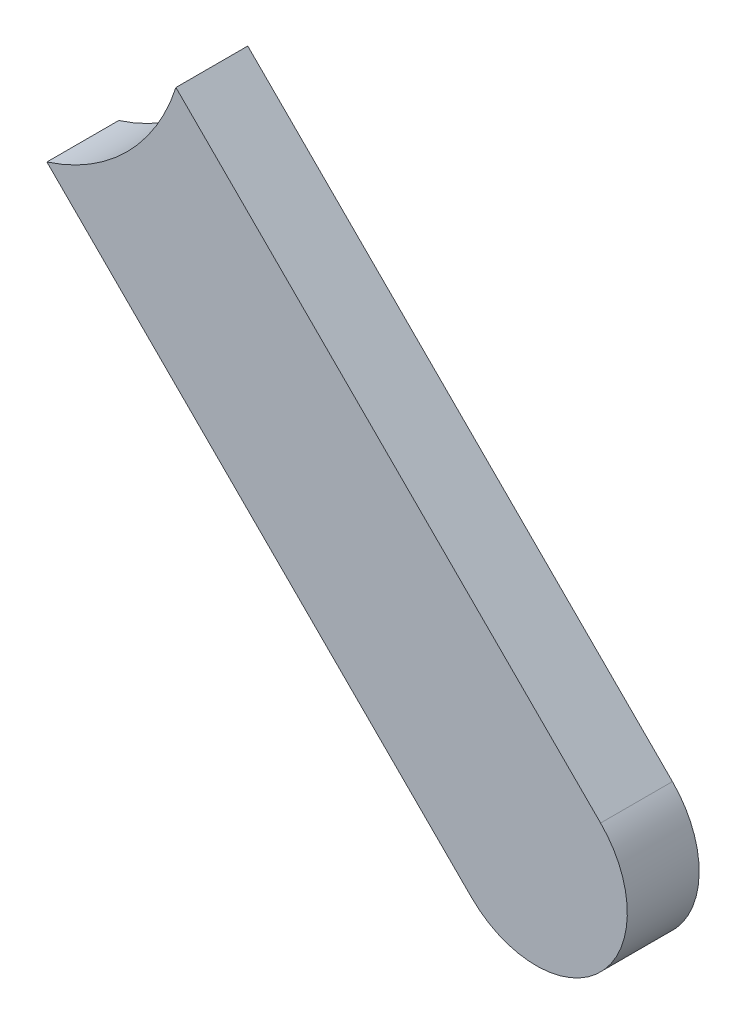
ISO-10303-21;
HEADER;
FILE_DESCRIPTION(('STEP AP214'),'2;1');
FILE_NAME('part.step','',(''),(''),'','','');
FILE_SCHEMA(('AUTOMOTIVE_DESIGN { 1 0 10303 214 1 1 1 1 }'));
ENDSEC;
DATA;
#1=APPLICATION_CONTEXT('core data for automotive mechanical design processes');
#2=APPLICATION_PROTOCOL_DEFINITION('international standard','automotive_design',2000,#1);
#3=PRODUCT_CONTEXT('',#1,'mechanical');
#4=PRODUCT('Part','Part','',(#3));
#5=PRODUCT_RELATED_PRODUCT_CATEGORY('part','',(#4));
#6=PRODUCT_DEFINITION_FORMATION('','',#4);
#7=PRODUCT_DEFINITION_CONTEXT('part definition',#1,'design');
#8=PRODUCT_DEFINITION('design','',#6,#7);
#9=PRODUCT_DEFINITION_SHAPE('','',#8);
#10=(LENGTH_UNIT() NAMED_UNIT(*) SI_UNIT(.MILLI.,.METRE.));
#11=(NAMED_UNIT(*) PLANE_ANGLE_UNIT() SI_UNIT($,.RADIAN.));
#12=(NAMED_UNIT(*) SI_UNIT($,.STERADIAN.) SOLID_ANGLE_UNIT());
#13=UNCERTAINTY_MEASURE_WITH_UNIT(LENGTH_MEASURE(1.E-05),#10,'distance_accuracy_value','');
#14=(GEOMETRIC_REPRESENTATION_CONTEXT(3) GLOBAL_UNCERTAINTY_ASSIGNED_CONTEXT((#13)) GLOBAL_UNIT_ASSIGNED_CONTEXT((#10,
#11,#12)) REPRESENTATION_CONTEXT('',''));
#15=CARTESIAN_POINT('',(0.,0.,0.));
#16=DIRECTION('',(0.,0.,1.));
#17=DIRECTION('',(1.,0.,0.));
#18=AXIS2_PLACEMENT_3D('',#15,#16,#17);
#19=CARTESIAN_POINT('',(129.194064664847,110.850461595153,0.));
#20=DIRECTION('',(0.707106781186548,0.707106781186548,0.));
#21=DIRECTION('',(0.707106781186548,-0.707106781186548,0.));
#22=AXIS2_PLACEMENT_3D('',#19,#20,#21);
#23=PLANE('',#22);
#24=DIRECTION('',(0.707106781186548,-0.707106781186548,0.));
#25=VECTOR('',#24,1.);
#26=CARTESIAN_POINT('',(128.8451322,111.19939406,0.1999996));
#27=LINE('',#26,#25);
#28=CARTESIAN_POINT('',(129.194064664847,110.850461595153,0.1999996));
#29=VERTEX_POINT('',#28);
#30=CARTESIAN_POINT('',(130.37639406,109.6681322,0.1999996));
#31=VERTEX_POINT('',#30);
#32=EDGE_CURVE('E11',#29,#31,#27,.T.);
#33=ORIENTED_EDGE('',*,*,#32,.F.);
#34=DIRECTION('',(0.,0.,1.));
#35=VECTOR('',#34,1.);
#36=CARTESIAN_POINT('',(129.194064664847,110.850461595153,0.));
#37=LINE('',#36,#35);
#38=CARTESIAN_POINT('',(129.194064664847,110.850461595153,0.));
#39=VERTEX_POINT('',#38);
#40=EDGE_CURVE('E24',#39,#29,#37,.T.);
#41=ORIENTED_EDGE('',*,*,#40,.F.);
#42=DIRECTION('',(0.707106781186548,-0.707106781186548,0.));
#43=VECTOR('',#42,1.);
#44=CARTESIAN_POINT('',(128.8451322,111.19939406,0.));
#45=LINE('',#44,#43);
#46=CARTESIAN_POINT('',(130.37639406,109.6681322,0.));
#47=VERTEX_POINT('',#46);
#48=EDGE_CURVE('E75',#39,#47,#45,.T.);
#49=ORIENTED_EDGE('',*,*,#48,.T.);
#50=DIRECTION('',(0.,0.,1.));
#51=VECTOR('',#50,1.);
#52=CARTESIAN_POINT('',(130.37639406,109.6681322,0.));
#53=LINE('',#52,#51);
#54=EDGE_CURVE('E37',#47,#31,#53,.T.);
#55=ORIENTED_EDGE('',*,*,#54,.T.);
#56=EDGE_LOOP('',(#33,#41,#49,#55));
#57=FACE_BOUND('',#56,.T.);
#58=ADVANCED_FACE('F17',(#57),#23,.F.);
#59=CARTESIAN_POINT('',(130.55599873,109.84773687,0.));
#60=DIRECTION('',(0.,0.,-1.));
#61=DIRECTION('',(-0.70710678118652,-0.707106781186576,0.));
#62=AXIS2_PLACEMENT_3D('',#59,#60,#61);
#63=CYLINDRICAL_SURFACE('',#62,0.253999360179556);
#64=CARTESIAN_POINT('',(130.55599873,109.84773687,0.1999996));
#65=DIRECTION('',(0.,0.,1.));
#66=DIRECTION('',(-0.70710678118652,-0.707106781186576,0.));
#67=AXIS2_PLACEMENT_3D('',#64,#65,#66);
#68=CIRCLE('',#67,0.253999360179556);
#69=CARTESIAN_POINT('',(130.7356034,110.02734154,0.1999996));
#70=VERTEX_POINT('',#69);
#71=EDGE_CURVE('E83',#31,#70,#68,.T.);
#72=ORIENTED_EDGE('',*,*,#71,.F.);
#73=ORIENTED_EDGE('',*,*,#54,.F.);
#74=CARTESIAN_POINT('',(130.55599873,109.84773687,0.));
#75=DIRECTION('',(0.,0.,1.));
#76=DIRECTION('',(-0.70710678118652,-0.707106781186576,0.));
#77=AXIS2_PLACEMENT_3D('',#74,#75,#76);
#78=CIRCLE('',#77,0.253999360179556);
#79=CARTESIAN_POINT('',(130.7356034,110.02734154,0.));
#80=VERTEX_POINT('',#79);
#81=EDGE_CURVE('E81',#47,#80,#78,.T.);
#82=ORIENTED_EDGE('',*,*,#81,.T.);
#83=DIRECTION('',(0.,0.,1.));
#84=VECTOR('',#83,1.);
#85=CARTESIAN_POINT('',(130.7356034,110.02734154,0.));
#86=LINE('',#85,#84);
#87=EDGE_CURVE('E67',#80,#70,#86,.T.);
#88=ORIENTED_EDGE('',*,*,#87,.T.);
#89=EDGE_LOOP('',(#72,#73,#82,#88));
#90=FACE_BOUND('',#89,.T.);
#91=ADVANCED_FACE('F89',(#90),#63,.T.);
#92=CARTESIAN_POINT('',(130.7356034,110.02734154,0.));
#93=DIRECTION('',(-0.707106781186544,-0.707106781186551,0.));
#94=DIRECTION('',(-0.707106781186551,0.707106781186544,0.));
#95=AXIS2_PLACEMENT_3D('',#92,#93,#94);
#96=PLANE('',#95);
#97=DIRECTION('',(-0.707106781186551,0.707106781186544,0.));
#98=VECTOR('',#97,1.);
#99=CARTESIAN_POINT('',(130.7356034,110.02734154,0.1999996));
#100=LINE('',#99,#98);
#101=CARTESIAN_POINT('',(129.553274004847,111.209670935153,0.1999996));
#102=VERTEX_POINT('',#101);
#103=EDGE_CURVE('E71',#70,#102,#100,.T.);
#104=ORIENTED_EDGE('',*,*,#103,.F.);
#105=ORIENTED_EDGE('',*,*,#87,.F.);
#106=DIRECTION('',(-0.707106781186551,0.707106781186544,0.));
#107=VECTOR('',#106,1.);
#108=CARTESIAN_POINT('',(130.7356034,110.02734154,0.));
#109=LINE('',#108,#107);
#110=CARTESIAN_POINT('',(129.553274004847,111.209670935153,0.));
#111=VERTEX_POINT('',#110);
#112=EDGE_CURVE('E63',#80,#111,#109,.T.);
#113=ORIENTED_EDGE('',*,*,#112,.T.);
#114=DIRECTION('',(0.,0.,1.));
#115=VECTOR('',#114,1.);
#116=CARTESIAN_POINT('',(129.553274004847,111.209670935153,0.));
#117=LINE('',#116,#115);
#118=EDGE_CURVE('E53',#111,#102,#117,.T.);
#119=ORIENTED_EDGE('',*,*,#118,.T.);
#120=EDGE_LOOP('',(#104,#105,#113,#119));
#121=FACE_BOUND('',#120,.T.);
#122=ADVANCED_FACE('F66',(#121),#96,.F.);
#123=CARTESIAN_POINT('',(129.0247356,111.379,0.));
#124=DIRECTION('',(0.,0.,-1.));
#125=DIRECTION('',(1.,0.,0.));
#126=AXIS2_PLACEMENT_3D('',#123,#124,#125);
#127=CYLINDRICAL_SURFACE('',#126,0.55500016);
#128=ORIENTED_EDGE('',*,*,#40,.T.);
#129=CARTESIAN_POINT('',(129.0247356,111.379,0.1999996));
#130=DIRECTION('',(0.,0.,1.));
#131=DIRECTION('',(1.,0.,0.));
#132=AXIS2_PLACEMENT_3D('',#129,#130,#131);
#133=CIRCLE('',#132,0.55500016);
#134=EDGE_CURVE('E59',#29,#102,#133,.T.);
#135=ORIENTED_EDGE('',*,*,#134,.T.);
#136=ORIENTED_EDGE('',*,*,#118,.F.);
#137=CARTESIAN_POINT('',(129.0247356,111.379,0.));
#138=DIRECTION('',(0.,0.,1.));
#139=DIRECTION('',(1.,0.,0.));
#140=AXIS2_PLACEMENT_3D('',#137,#138,#139);
#141=CIRCLE('',#140,0.55500016);
#142=EDGE_CURVE('E57',#39,#111,#141,.T.);
#143=ORIENTED_EDGE('',*,*,#142,.F.);
#144=EDGE_LOOP('',(#128,#135,#136,#143));
#145=FACE_BOUND('',#144,.T.);
#146=ADVANCED_FACE('F55',(#145),#127,.F.);
#147=CARTESIAN_POINT('',(128.8451322,111.19939406,0.));
#148=DIRECTION('',(0.,0.,-1.));
#149=DIRECTION('',(-1.,0.,0.));
#150=AXIS2_PLACEMENT_3D('',#147,#148,#149);
#151=PLANE('',#150);
#152=ORIENTED_EDGE('',*,*,#48,.F.);
#153=ORIENTED_EDGE('',*,*,#142,.T.);
#154=ORIENTED_EDGE('',*,*,#112,.F.);
#155=ORIENTED_EDGE('',*,*,#81,.F.);
#156=EDGE_LOOP('',(#152,#153,#154,#155));
#157=FACE_BOUND('',#156,.T.);
#158=ADVANCED_FACE('F74',(#157),#151,.T.);
#159=CARTESIAN_POINT('',(128.8451322,111.19939406,0.1999996));
#160=DIRECTION('',(0.,0.,-1.));
#161=DIRECTION('',(-1.,0.,0.));
#162=AXIS2_PLACEMENT_3D('',#159,#160,#161);
#163=PLANE('',#162);
#164=ORIENTED_EDGE('',*,*,#134,.F.);
#165=ORIENTED_EDGE('',*,*,#32,.T.);
#166=ORIENTED_EDGE('',*,*,#71,.T.);
#167=ORIENTED_EDGE('',*,*,#103,.T.);
#168=EDGE_LOOP('',(#164,#165,#166,#167));
#169=FACE_BOUND('',#168,.T.);
#170=ADVANCED_FACE('F91',(#169),#163,.F.);
#171=CLOSED_SHELL('',(#58,#91,#122,#146,#158,#170));
#172=MANIFOLD_SOLID_BREP('B1',#171);
#173=ADVANCED_BREP_SHAPE_REPRESENTATION('',(#18,#172),#14);
#174=SHAPE_DEFINITION_REPRESENTATION(#9,#173);
ENDSEC;
END-ISO-10303-21;
